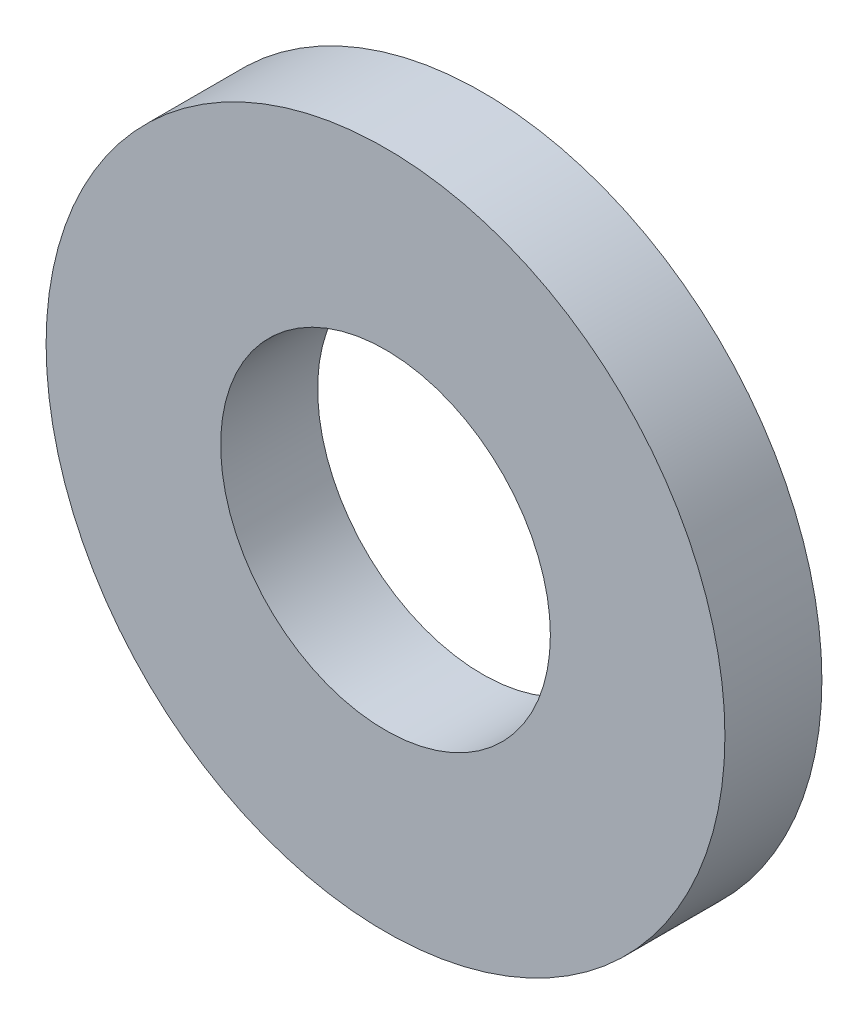
ISO-10303-21;
HEADER;
FILE_DESCRIPTION(('STEP AP214'),'2;1');
FILE_NAME('part.step','',(''),(''),'','','');
FILE_SCHEMA(('AUTOMOTIVE_DESIGN { 1 0 10303 214 1 1 1 1 }'));
ENDSEC;
DATA;
#1=APPLICATION_CONTEXT('core data for automotive mechanical design processes');
#2=APPLICATION_PROTOCOL_DEFINITION('international standard','automotive_design',2000,#1);
#3=PRODUCT_CONTEXT('',#1,'mechanical');
#4=PRODUCT('Part','Part','',(#3));
#5=PRODUCT_RELATED_PRODUCT_CATEGORY('part','',(#4));
#6=PRODUCT_DEFINITION_FORMATION('','',#4);
#7=PRODUCT_DEFINITION_CONTEXT('part definition',#1,'design');
#8=PRODUCT_DEFINITION('design','',#6,#7);
#9=PRODUCT_DEFINITION_SHAPE('','',#8);
#10=(LENGTH_UNIT() NAMED_UNIT(*) SI_UNIT(.MILLI.,.METRE.));
#11=(NAMED_UNIT(*) PLANE_ANGLE_UNIT() SI_UNIT($,.RADIAN.));
#12=(NAMED_UNIT(*) SI_UNIT($,.STERADIAN.) SOLID_ANGLE_UNIT());
#13=UNCERTAINTY_MEASURE_WITH_UNIT(LENGTH_MEASURE(1.E-05),#10,'distance_accuracy_value','');
#14=(GEOMETRIC_REPRESENTATION_CONTEXT(3) GLOBAL_UNCERTAINTY_ASSIGNED_CONTEXT((#13)) GLOBAL_UNIT_ASSIGNED_CONTEXT((#10,
#11,#12)) REPRESENTATION_CONTEXT('',''));
#15=CARTESIAN_POINT('',(0.,0.,0.));
#16=DIRECTION('',(0.,0.,1.));
#17=DIRECTION('',(1.,0.,0.));
#18=AXIS2_PLACEMENT_3D('',#15,#16,#17);
#19=CARTESIAN_POINT('',(0.,0.,0.5));
#20=DIRECTION('',(0.,0.,1.));
#21=DIRECTION('',(1.,0.,0.));
#22=AXIS2_PLACEMENT_3D('',#19,#20,#21);
#23=PLANE('',#22);
#24=CARTESIAN_POINT('',(0.,0.,0.5));
#25=DIRECTION('',(0.,0.,1.));
#26=DIRECTION('',(1.,0.,0.));
#27=AXIS2_PLACEMENT_3D('',#24,#25,#26);
#28=CIRCLE('',#27,3.5);
#29=CARTESIAN_POINT('',(3.5,0.,0.5));
#30=VERTEX_POINT('',#29);
#31=EDGE_CURVE('E10',#30,#30,#28,.T.);
#32=ORIENTED_EDGE('',*,*,#31,.T.);
#33=EDGE_LOOP('',(#32));
#34=FACE_BOUND('',#33,.T.);
#35=CARTESIAN_POINT('',(0.,0.,0.5));
#36=DIRECTION('',(0.,0.,1.));
#37=DIRECTION('',(1.,0.,0.));
#38=AXIS2_PLACEMENT_3D('',#35,#36,#37);
#39=CIRCLE('',#38,1.7);
#40=CARTESIAN_POINT('',(1.7,0.,0.5));
#41=VERTEX_POINT('',#40);
#42=EDGE_CURVE('E55',#41,#41,#39,.T.);
#43=ORIENTED_EDGE('',*,*,#42,.F.);
#44=EDGE_LOOP('',(#43));
#45=FACE_BOUND('',#44,.T.);
#46=ADVANCED_FACE('F41',(#34,#45),#23,.T.);
#47=CARTESIAN_POINT('',(0.,0.,-0.5));
#48=DIRECTION('',(0.,0.,1.));
#49=DIRECTION('',(1.,0.,0.));
#50=AXIS2_PLACEMENT_3D('',#47,#48,#49);
#51=PLANE('',#50);
#52=CARTESIAN_POINT('',(0.,0.,-0.5));
#53=DIRECTION('',(0.,0.,1.));
#54=DIRECTION('',(1.,0.,0.));
#55=AXIS2_PLACEMENT_3D('',#52,#53,#54);
#56=CIRCLE('',#55,3.5);
#57=CARTESIAN_POINT('',(3.5,0.,-0.5));
#58=VERTEX_POINT('',#57);
#59=EDGE_CURVE('E44',#58,#58,#56,.T.);
#60=ORIENTED_EDGE('',*,*,#59,.F.);
#61=EDGE_LOOP('',(#60));
#62=FACE_BOUND('',#61,.T.);
#63=CARTESIAN_POINT('',(0.,0.,-0.5));
#64=DIRECTION('',(0.,0.,1.));
#65=DIRECTION('',(1.,0.,0.));
#66=AXIS2_PLACEMENT_3D('',#63,#64,#65);
#67=CIRCLE('',#66,1.7);
#68=CARTESIAN_POINT('',(1.7,0.,-0.5));
#69=VERTEX_POINT('',#68);
#70=EDGE_CURVE('E53',#69,#69,#67,.T.);
#71=ORIENTED_EDGE('',*,*,#70,.T.);
#72=EDGE_LOOP('',(#71));
#73=FACE_BOUND('',#72,.T.);
#74=ADVANCED_FACE('F63',(#62,#73),#51,.F.);
#75=CARTESIAN_POINT('',(0.,0.,0.5));
#76=DIRECTION('',(0.,0.,-1.));
#77=DIRECTION('',(-1.,0.,0.));
#78=AXIS2_PLACEMENT_3D('',#75,#76,#77);
#79=CYLINDRICAL_SURFACE('',#78,3.5);
#80=ORIENTED_EDGE('',*,*,#31,.F.);
#81=EDGE_LOOP('',(#80));
#82=FACE_BOUND('',#81,.T.);
#83=ORIENTED_EDGE('',*,*,#59,.T.);
#84=EDGE_LOOP('',(#83));
#85=FACE_BOUND('',#84,.T.);
#86=ADVANCED_FACE('F43',(#82,#85),#79,.T.);
#87=CARTESIAN_POINT('',(0.,0.,0.5));
#88=DIRECTION('',(0.,0.,-1.));
#89=DIRECTION('',(-1.,0.,0.));
#90=AXIS2_PLACEMENT_3D('',#87,#88,#89);
#91=CYLINDRICAL_SURFACE('',#90,1.7);
#92=ORIENTED_EDGE('',*,*,#42,.T.);
#93=EDGE_LOOP('',(#92));
#94=FACE_BOUND('',#93,.T.);
#95=ORIENTED_EDGE('',*,*,#70,.F.);
#96=EDGE_LOOP('',(#95));
#97=FACE_BOUND('',#96,.T.);
#98=ADVANCED_FACE('F58',(#94,#97),#91,.F.);
#99=CLOSED_SHELL('',(#46,#74,#86,#98));
#100=MANIFOLD_SOLID_BREP('B2',#99);
#101=ADVANCED_BREP_SHAPE_REPRESENTATION('',(#18,#100),#14);
#102=SHAPE_DEFINITION_REPRESENTATION(#9,#101);
ENDSEC;
END-ISO-10303-21;
